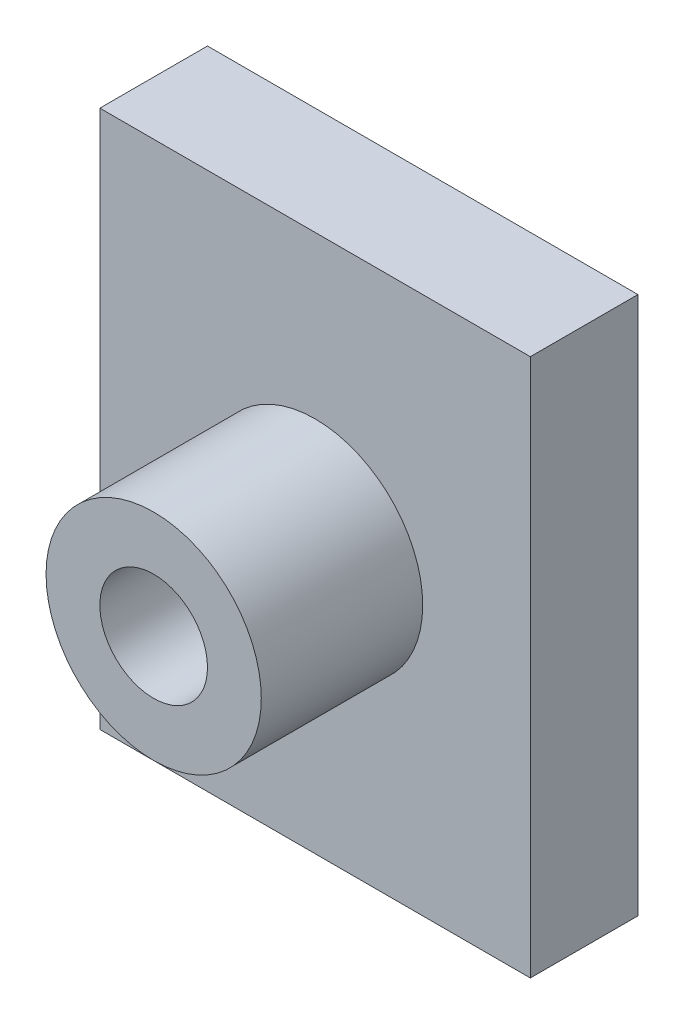
ISO-10303-21;
HEADER;
FILE_DESCRIPTION(('STEP AP214'),'2;1');
FILE_NAME('part.step','',(''),(''),'','','');
FILE_SCHEMA(('AUTOMOTIVE_DESIGN { 1 0 10303 214 1 1 1 1 }'));
ENDSEC;
DATA;
#1=APPLICATION_CONTEXT('core data for automotive mechanical design processes');
#2=APPLICATION_PROTOCOL_DEFINITION('international standard','automotive_design',2000,#1);
#3=PRODUCT_CONTEXT('',#1,'mechanical');
#4=PRODUCT('Part','Part','',(#3));
#5=PRODUCT_RELATED_PRODUCT_CATEGORY('part','',(#4));
#6=PRODUCT_DEFINITION_FORMATION('','',#4);
#7=PRODUCT_DEFINITION_CONTEXT('part definition',#1,'design');
#8=PRODUCT_DEFINITION('design','',#6,#7);
#9=PRODUCT_DEFINITION_SHAPE('','',#8);
#10=(LENGTH_UNIT() NAMED_UNIT(*) SI_UNIT(.MILLI.,.METRE.));
#11=(NAMED_UNIT(*) PLANE_ANGLE_UNIT() SI_UNIT($,.RADIAN.));
#12=(NAMED_UNIT(*) SI_UNIT($,.STERADIAN.) SOLID_ANGLE_UNIT());
#13=UNCERTAINTY_MEASURE_WITH_UNIT(LENGTH_MEASURE(1.E-05),#10,'distance_accuracy_value','');
#14=(GEOMETRIC_REPRESENTATION_CONTEXT(3) GLOBAL_UNCERTAINTY_ASSIGNED_CONTEXT((#13)) GLOBAL_UNIT_ASSIGNED_CONTEXT((#10,
#11,#12)) REPRESENTATION_CONTEXT('',''));
#15=CARTESIAN_POINT('',(0.,0.,0.));
#16=DIRECTION('',(0.,0.,1.));
#17=DIRECTION('',(1.,0.,0.));
#18=AXIS2_PLACEMENT_3D('',#15,#16,#17);
#19=CARTESIAN_POINT('',(-40.,50.,20.));
#20=DIRECTION('',(1.,0.,0.));
#21=DIRECTION('',(0.,1.,0.));
#22=AXIS2_PLACEMENT_3D('',#19,#20,#21);
#23=PLANE('',#22);
#24=DIRECTION('',(0.,-1.,0.));
#25=VECTOR('',#24,1.);
#26=CARTESIAN_POINT('',(-40.,50.,0.));
#27=LINE('',#26,#25);
#28=CARTESIAN_POINT('',(-40.,50.,0.));
#29=VERTEX_POINT('',#28);
#30=CARTESIAN_POINT('',(-40.,-50.,0.));
#31=VERTEX_POINT('',#30);
#32=EDGE_CURVE('E111',#29,#31,#27,.T.);
#33=ORIENTED_EDGE('',*,*,#32,.T.);
#34=DIRECTION('',(0.,0.,-1.));
#35=VECTOR('',#34,1.);
#36=CARTESIAN_POINT('',(-40.,-50.,20.));
#37=LINE('',#36,#35);
#38=CARTESIAN_POINT('',(-40.,-50.,20.));
#39=VERTEX_POINT('',#38);
#40=EDGE_CURVE('E48',#39,#31,#37,.T.);
#41=ORIENTED_EDGE('',*,*,#40,.F.);
#42=DIRECTION('',(0.,-1.,0.));
#43=VECTOR('',#42,1.);
#44=CARTESIAN_POINT('',(-40.,50.,20.));
#45=LINE('',#44,#43);
#46=CARTESIAN_POINT('',(-40.,50.,20.));
#47=VERTEX_POINT('',#46);
#48=EDGE_CURVE('E98',#47,#39,#45,.T.);
#49=ORIENTED_EDGE('',*,*,#48,.F.);
#50=DIRECTION('',(0.,0.,-1.));
#51=VECTOR('',#50,1.);
#52=CARTESIAN_POINT('',(-40.,50.,20.));
#53=LINE('',#52,#51);
#54=EDGE_CURVE('E107',#47,#29,#53,.T.);
#55=ORIENTED_EDGE('',*,*,#54,.T.);
#56=EDGE_LOOP('',(#33,#41,#49,#55));
#57=FACE_BOUND('',#56,.T.);
#58=ADVANCED_FACE('F45',(#57),#23,.F.);
#59=CARTESIAN_POINT('',(-40.,-50.,20.));
#60=DIRECTION('',(0.,1.,0.));
#61=DIRECTION('',(0.,0.,1.));
#62=AXIS2_PLACEMENT_3D('',#59,#60,#61);
#63=PLANE('',#62);
#64=DIRECTION('',(1.,0.,0.));
#65=VECTOR('',#64,1.);
#66=CARTESIAN_POINT('',(-40.,-50.,0.));
#67=LINE('',#66,#65);
#68=CARTESIAN_POINT('',(40.,-50.,0.));
#69=VERTEX_POINT('',#68);
#70=EDGE_CURVE('E103',#31,#69,#67,.T.);
#71=ORIENTED_EDGE('',*,*,#70,.T.);
#72=DIRECTION('',(0.,0.,-1.));
#73=VECTOR('',#72,1.);
#74=CARTESIAN_POINT('',(40.,-50.,20.));
#75=LINE('',#74,#73);
#76=CARTESIAN_POINT('',(40.,-50.,20.));
#77=VERTEX_POINT('',#76);
#78=EDGE_CURVE('E101',#77,#69,#75,.T.);
#79=ORIENTED_EDGE('',*,*,#78,.F.);
#80=DIRECTION('',(1.,0.,0.));
#81=VECTOR('',#80,1.);
#82=CARTESIAN_POINT('',(-40.,-50.,20.));
#83=LINE('',#82,#81);
#84=EDGE_CURVE('E93',#39,#77,#83,.T.);
#85=ORIENTED_EDGE('',*,*,#84,.F.);
#86=ORIENTED_EDGE('',*,*,#40,.T.);
#87=EDGE_LOOP('',(#71,#79,#85,#86));
#88=FACE_BOUND('',#87,.T.);
#89=ADVANCED_FACE('F102',(#88),#63,.F.);
#90=CARTESIAN_POINT('',(40.,50.,20.));
#91=DIRECTION('',(-1.,0.,0.));
#92=DIRECTION('',(0.,-1.,0.));
#93=AXIS2_PLACEMENT_3D('',#90,#91,#92);
#94=PLANE('',#93);
#95=DIRECTION('',(0.,1.,0.));
#96=VECTOR('',#95,1.);
#97=CARTESIAN_POINT('',(40.,50.,0.));
#98=LINE('',#97,#96);
#99=CARTESIAN_POINT('',(40.,50.,0.));
#100=VERTEX_POINT('',#99);
#101=EDGE_CURVE('E79',#69,#100,#98,.T.);
#102=ORIENTED_EDGE('',*,*,#101,.T.);
#103=DIRECTION('',(0.,0.,-1.));
#104=VECTOR('',#103,1.);
#105=CARTESIAN_POINT('',(40.,50.,20.));
#106=LINE('',#105,#104);
#107=CARTESIAN_POINT('',(40.,50.,20.));
#108=VERTEX_POINT('',#107);
#109=EDGE_CURVE('E104',#108,#100,#106,.T.);
#110=ORIENTED_EDGE('',*,*,#109,.F.);
#111=DIRECTION('',(0.,1.,0.));
#112=VECTOR('',#111,1.);
#113=CARTESIAN_POINT('',(40.,50.,20.));
#114=LINE('',#113,#112);
#115=EDGE_CURVE('E96',#77,#108,#114,.T.);
#116=ORIENTED_EDGE('',*,*,#115,.F.);
#117=ORIENTED_EDGE('',*,*,#78,.T.);
#118=EDGE_LOOP('',(#102,#110,#116,#117));
#119=FACE_BOUND('',#118,.T.);
#120=ADVANCED_FACE('F105',(#119),#94,.F.);
#121=CARTESIAN_POINT('',(-40.,50.,20.));
#122=DIRECTION('',(0.,-1.,0.));
#123=DIRECTION('',(0.,0.,-1.));
#124=AXIS2_PLACEMENT_3D('',#121,#122,#123);
#125=PLANE('',#124);
#126=DIRECTION('',(-1.,0.,0.));
#127=VECTOR('',#126,1.);
#128=CARTESIAN_POINT('',(-40.,50.,0.));
#129=LINE('',#128,#127);
#130=EDGE_CURVE('E85',#100,#29,#129,.T.);
#131=ORIENTED_EDGE('',*,*,#130,.T.);
#132=ORIENTED_EDGE('',*,*,#54,.F.);
#133=DIRECTION('',(-1.,0.,0.));
#134=VECTOR('',#133,1.);
#135=CARTESIAN_POINT('',(-40.,50.,20.));
#136=LINE('',#135,#134);
#137=EDGE_CURVE('E62',#108,#47,#136,.T.);
#138=ORIENTED_EDGE('',*,*,#137,.F.);
#139=ORIENTED_EDGE('',*,*,#109,.T.);
#140=EDGE_LOOP('',(#131,#132,#138,#139));
#141=FACE_BOUND('',#140,.T.);
#142=ADVANCED_FACE('F119',(#141),#125,.F.);
#143=CARTESIAN_POINT('',(0.,0.,20.));
#144=DIRECTION('',(0.,0.,1.));
#145=DIRECTION('',(1.,0.,0.));
#146=AXIS2_PLACEMENT_3D('',#143,#144,#145);
#147=PLANE('',#146);
#148=CARTESIAN_POINT('',(0.,0.,20.));
#149=DIRECTION('',(0.,0.,1.));
#150=DIRECTION('',(1.,0.,0.));
#151=AXIS2_PLACEMENT_3D('',#148,#149,#150);
#152=CIRCLE('',#151,20.);
#153=CARTESIAN_POINT('',(20.,0.,20.));
#154=VERTEX_POINT('',#153);
#155=EDGE_CURVE('E13',#154,#154,#152,.T.);
#156=ORIENTED_EDGE('',*,*,#155,.F.);
#157=EDGE_LOOP('',(#156));
#158=FACE_BOUND('',#157,.T.);
#159=ORIENTED_EDGE('',*,*,#48,.T.);
#160=ORIENTED_EDGE('',*,*,#84,.T.);
#161=ORIENTED_EDGE('',*,*,#115,.T.);
#162=ORIENTED_EDGE('',*,*,#137,.T.);
#163=EDGE_LOOP('',(#159,#160,#161,#162));
#164=FACE_BOUND('',#163,.T.);
#165=ADVANCED_FACE('F94',(#158,#164),#147,.T.);
#166=CARTESIAN_POINT('',(0.,0.,0.));
#167=DIRECTION('',(0.,0.,1.));
#168=DIRECTION('',(1.,0.,0.));
#169=AXIS2_PLACEMENT_3D('',#166,#167,#168);
#170=PLANE('',#169);
#171=CARTESIAN_POINT('',(0.,0.,0.));
#172=DIRECTION('',(0.,0.,1.));
#173=DIRECTION('',(1.,0.,0.));
#174=AXIS2_PLACEMENT_3D('',#171,#172,#173);
#175=CIRCLE('',#174,10.);
#176=CARTESIAN_POINT('',(10.,0.,0.));
#177=VERTEX_POINT('',#176);
#178=EDGE_CURVE('E127',#177,#177,#175,.T.);
#179=ORIENTED_EDGE('',*,*,#178,.T.);
#180=EDGE_LOOP('',(#179));
#181=FACE_BOUND('',#180,.T.);
#182=ORIENTED_EDGE('',*,*,#32,.F.);
#183=ORIENTED_EDGE('',*,*,#130,.F.);
#184=ORIENTED_EDGE('',*,*,#101,.F.);
#185=ORIENTED_EDGE('',*,*,#70,.F.);
#186=EDGE_LOOP('',(#182,#183,#184,#185));
#187=FACE_BOUND('',#186,.T.);
#188=ADVANCED_FACE('F122',(#181,#187),#170,.F.);
#189=CARTESIAN_POINT('',(0.,0.,50.));
#190=DIRECTION('',(0.,0.,-1.));
#191=DIRECTION('',(-1.,0.,0.));
#192=AXIS2_PLACEMENT_3D('',#189,#190,#191);
#193=CYLINDRICAL_SURFACE('',#192,20.);
#194=CARTESIAN_POINT('',(0.,0.,50.));
#195=DIRECTION('',(0.,0.,1.));
#196=DIRECTION('',(1.,0.,0.));
#197=AXIS2_PLACEMENT_3D('',#194,#195,#196);
#198=CIRCLE('',#197,20.);
#199=CARTESIAN_POINT('',(20.,0.,50.));
#200=VERTEX_POINT('',#199);
#201=EDGE_CURVE('E114',#200,#200,#198,.T.);
#202=ORIENTED_EDGE('',*,*,#201,.F.);
#203=EDGE_LOOP('',(#202));
#204=FACE_BOUND('',#203,.T.);
#205=ORIENTED_EDGE('',*,*,#155,.T.);
#206=EDGE_LOOP('',(#205));
#207=FACE_BOUND('',#206,.T.);
#208=ADVANCED_FACE('F144',(#204,#207),#193,.T.);
#209=CARTESIAN_POINT('',(0.,0.,50.));
#210=DIRECTION('',(0.,0.,1.));
#211=DIRECTION('',(1.,0.,0.));
#212=AXIS2_PLACEMENT_3D('',#209,#210,#211);
#213=PLANE('',#212);
#214=CARTESIAN_POINT('',(0.,0.,50.));
#215=DIRECTION('',(0.,0.,1.));
#216=DIRECTION('',(1.,0.,0.));
#217=AXIS2_PLACEMENT_3D('',#214,#215,#216);
#218=CIRCLE('',#217,10.);
#219=CARTESIAN_POINT('',(10.,0.,50.));
#220=VERTEX_POINT('',#219);
#221=EDGE_CURVE('E128',#220,#220,#218,.T.);
#222=ORIENTED_EDGE('',*,*,#221,.F.);
#223=EDGE_LOOP('',(#222));
#224=FACE_BOUND('',#223,.T.);
#225=ORIENTED_EDGE('',*,*,#201,.T.);
#226=EDGE_LOOP('',(#225));
#227=FACE_BOUND('',#226,.T.);
#228=ADVANCED_FACE('F138',(#224,#227),#213,.T.);
#229=CARTESIAN_POINT('',(0.,0.,0.));
#230=DIRECTION('',(0.,0.,1.));
#231=DIRECTION('',(1.,0.,0.));
#232=AXIS2_PLACEMENT_3D('',#229,#230,#231);
#233=CYLINDRICAL_SURFACE('',#232,10.);
#234=ORIENTED_EDGE('',*,*,#178,.F.);
#235=EDGE_LOOP('',(#234));
#236=FACE_BOUND('',#235,.T.);
#237=ORIENTED_EDGE('',*,*,#221,.T.);
#238=EDGE_LOOP('',(#237));
#239=FACE_BOUND('',#238,.T.);
#240=ADVANCED_FACE('F135',(#236,#239),#233,.F.);
#241=CLOSED_SHELL('',(#58,#89,#120,#142,#165,#188,#208,#228,#240));
#242=MANIFOLD_SOLID_BREP('B2',#241);
#243=ADVANCED_BREP_SHAPE_REPRESENTATION('',(#18,#242),#14);
#244=SHAPE_DEFINITION_REPRESENTATION(#9,#243);
ENDSEC;
END-ISO-10303-21;
